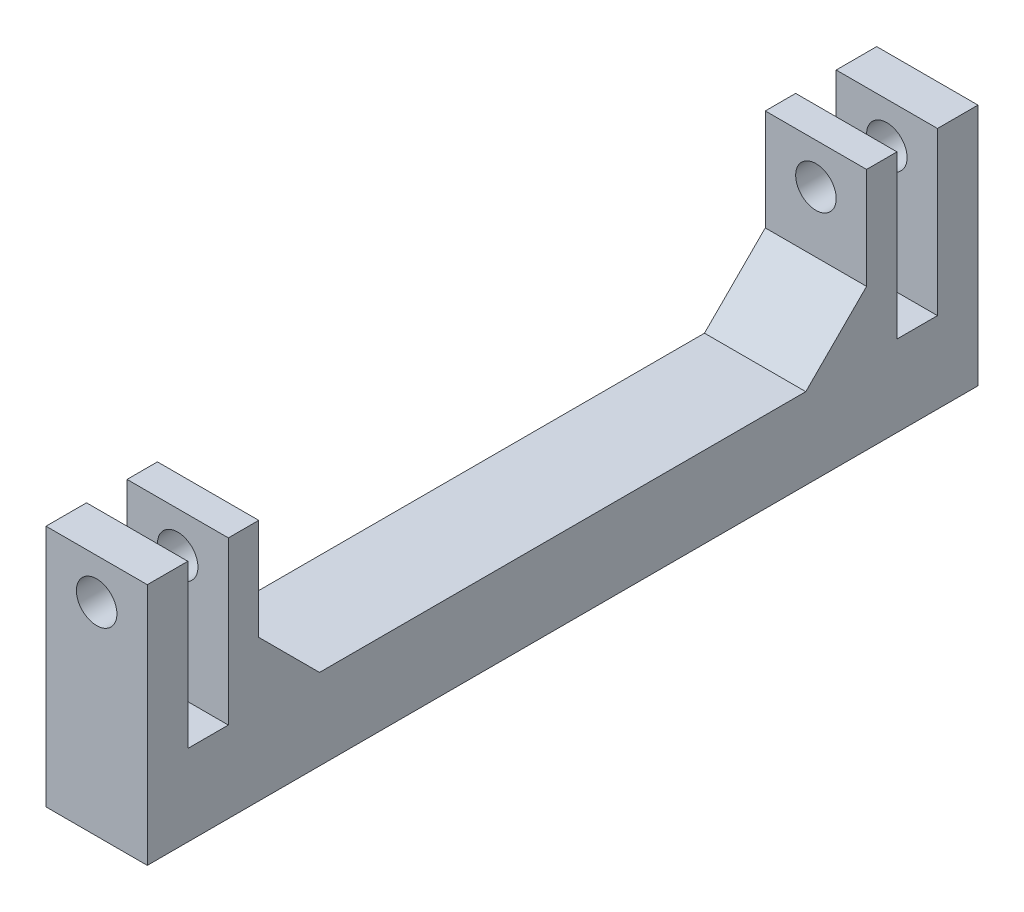
ISO-10303-21;
HEADER;
FILE_DESCRIPTION(('STEP AP214'),'2;1');
FILE_NAME('part.step','',(''),(''),'','','');
FILE_SCHEMA(('AUTOMOTIVE_DESIGN { 1 0 10303 214 1 1 1 1 }'));
ENDSEC;
DATA;
#1=APPLICATION_CONTEXT('core data for automotive mechanical design processes');
#2=APPLICATION_PROTOCOL_DEFINITION('international standard','automotive_design',2000,#1);
#3=PRODUCT_CONTEXT('',#1,'mechanical');
#4=PRODUCT('Part','Part','',(#3));
#5=PRODUCT_RELATED_PRODUCT_CATEGORY('part','',(#4));
#6=PRODUCT_DEFINITION_FORMATION('','',#4);
#7=PRODUCT_DEFINITION_CONTEXT('part definition',#1,'design');
#8=PRODUCT_DEFINITION('design','',#6,#7);
#9=PRODUCT_DEFINITION_SHAPE('','',#8);
#10=(LENGTH_UNIT() NAMED_UNIT(*) SI_UNIT(.MILLI.,.METRE.));
#11=(NAMED_UNIT(*) PLANE_ANGLE_UNIT() SI_UNIT($,.RADIAN.));
#12=(NAMED_UNIT(*) SI_UNIT($,.STERADIAN.) SOLID_ANGLE_UNIT());
#13=UNCERTAINTY_MEASURE_WITH_UNIT(LENGTH_MEASURE(1.E-05),#10,'distance_accuracy_value','');
#14=(GEOMETRIC_REPRESENTATION_CONTEXT(3) GLOBAL_UNCERTAINTY_ASSIGNED_CONTEXT((#13)) GLOBAL_UNIT_ASSIGNED_CONTEXT((#10,
#11,#12)) REPRESENTATION_CONTEXT('',''));
#15=CARTESIAN_POINT('',(0.,0.,0.));
#16=DIRECTION('',(0.,0.,1.));
#17=DIRECTION('',(1.,0.,0.));
#18=AXIS2_PLACEMENT_3D('',#15,#16,#17);
#19=CARTESIAN_POINT('',(-250.,130.,280.));
#20=DIRECTION('',(1.,0.,0.));
#21=DIRECTION('',(0.,1.,0.));
#22=AXIS2_PLACEMENT_3D('',#19,#20,#21);
#23=PLANE('',#22);
#24=DIRECTION('',(0.,-1.,0.));
#25=VECTOR('',#24,1.);
#26=CARTESIAN_POINT('',(-250.,0.,230.));
#27=LINE('',#26,#25);
#28=CARTESIAN_POINT('',(-250.,130.,230.));
#29=VERTEX_POINT('',#28);
#30=CARTESIAN_POINT('',(-250.,10.,230.));
#31=VERTEX_POINT('',#30);
#32=EDGE_CURVE('E214',#29,#31,#27,.T.);
#33=ORIENTED_EDGE('',*,*,#32,.F.);
#34=DIRECTION('',(0.,0.,-1.));
#35=VECTOR('',#34,1.);
#36=CARTESIAN_POINT('',(-250.,130.,230.));
#37=LINE('',#36,#35);
#38=CARTESIAN_POINT('',(-250.,130.,210.));
#39=VERTEX_POINT('',#38);
#40=EDGE_CURVE('E359',#29,#39,#37,.T.);
#41=ORIENTED_EDGE('',*,*,#40,.T.);
#42=DIRECTION('',(0.,-1.,0.));
#43=VECTOR('',#42,1.);
#44=CARTESIAN_POINT('',(-250.,50.,210.));
#45=LINE('',#44,#43);
#46=CARTESIAN_POINT('',(-250.,50.,210.));
#47=VERTEX_POINT('',#46);
#48=EDGE_CURVE('E339',#39,#47,#45,.T.);
#49=ORIENTED_EDGE('',*,*,#48,.T.);
#50=DIRECTION('',(0.,0.,-1.));
#51=VECTOR('',#50,1.);
#52=CARTESIAN_POINT('',(-250.,50.,0.));
#53=LINE('',#52,#51);
#54=CARTESIAN_POINT('',(-250.,50.,190.));
#55=VERTEX_POINT('',#54);
#56=EDGE_CURVE('E356',#47,#55,#53,.T.);
#57=ORIENTED_EDGE('',*,*,#56,.T.);
#58=DIRECTION('',(0.,1.,0.));
#59=VECTOR('',#58,1.);
#60=CARTESIAN_POINT('',(-250.,50.,190.));
#61=LINE('',#60,#59);
#62=CARTESIAN_POINT('',(-250.,130.,190.));
#63=VERTEX_POINT('',#62);
#64=EDGE_CURVE('E349',#55,#63,#61,.T.);
#65=ORIENTED_EDGE('',*,*,#64,.T.);
#66=DIRECTION('',(0.,0.,-1.));
#67=VECTOR('',#66,1.);
#68=CARTESIAN_POINT('',(-250.,130.,230.));
#69=LINE('',#68,#67);
#70=CARTESIAN_POINT('',(-250.,130.,175.));
#71=VERTEX_POINT('',#70);
#72=EDGE_CURVE('E290',#63,#71,#69,.T.);
#73=ORIENTED_EDGE('',*,*,#72,.T.);
#74=DIRECTION('',(0.,-1.,0.));
#75=VECTOR('',#74,1.);
#76=CARTESIAN_POINT('',(-250.,50.,175.));
#77=LINE('',#76,#75);
#78=CARTESIAN_POINT('',(-250.,80.,175.));
#79=VERTEX_POINT('',#78);
#80=EDGE_CURVE('E323',#71,#79,#77,.T.);
#81=ORIENTED_EDGE('',*,*,#80,.T.);
#82=DIRECTION('',(0.,0.707106781186544,0.707106781186551));
#83=VECTOR('',#82,1.);
#84=CARTESIAN_POINT('',(-250.,50.,145.));
#85=LINE('',#84,#83);
#86=CARTESIAN_POINT('',(-250.,50.,145.));
#87=VERTEX_POINT('',#86);
#88=EDGE_CURVE('E334',#87,#79,#85,.T.);
#89=ORIENTED_EDGE('',*,*,#88,.F.);
#90=DIRECTION('',(0.,0.,-1.));
#91=VECTOR('',#90,1.);
#92=CARTESIAN_POINT('',(-250.,50.,50.));
#93=LINE('',#92,#91);
#94=CARTESIAN_POINT('',(-250.,50.,-95.));
#95=VERTEX_POINT('',#94);
#96=EDGE_CURVE('E269',#87,#95,#93,.T.);
#97=ORIENTED_EDGE('',*,*,#96,.T.);
#98=DIRECTION('',(0.,-0.707106781186544,0.707106781186551));
#99=VECTOR('',#98,1.);
#100=CARTESIAN_POINT('',(-250.,50.,-95.));
#101=LINE('',#100,#99);
#102=CARTESIAN_POINT('',(-250.,80.,-125.));
#103=VERTEX_POINT('',#102);
#104=EDGE_CURVE('E11',#103,#95,#101,.T.);
#105=ORIENTED_EDGE('',*,*,#104,.F.);
#106=DIRECTION('',(0.,1.,0.));
#107=VECTOR('',#106,1.);
#108=CARTESIAN_POINT('',(-250.,50.,-125.));
#109=LINE('',#108,#107);
#110=CARTESIAN_POINT('',(-250.,130.,-125.));
#111=VERTEX_POINT('',#110);
#112=EDGE_CURVE('E20',#103,#111,#109,.T.);
#113=ORIENTED_EDGE('',*,*,#112,.T.);
#114=DIRECTION('',(0.,0.,-1.));
#115=VECTOR('',#114,1.);
#116=CARTESIAN_POINT('',(-250.,130.,280.));
#117=LINE('',#116,#115);
#118=CARTESIAN_POINT('',(-250.,130.,-140.));
#119=VERTEX_POINT('',#118);
#120=EDGE_CURVE('E242',#111,#119,#117,.T.);
#121=ORIENTED_EDGE('',*,*,#120,.T.);
#122=DIRECTION('',(0.,-1.,0.));
#123=VECTOR('',#122,1.);
#124=CARTESIAN_POINT('',(-250.,50.,-140.));
#125=LINE('',#124,#123);
#126=CARTESIAN_POINT('',(-250.,50.,-140.));
#127=VERTEX_POINT('',#126);
#128=EDGE_CURVE('E233',#119,#127,#125,.T.);
#129=ORIENTED_EDGE('',*,*,#128,.T.);
#130=DIRECTION('',(0.,0.,-1.));
#131=VECTOR('',#130,1.);
#132=CARTESIAN_POINT('',(-250.,50.,50.));
#133=LINE('',#132,#131);
#134=CARTESIAN_POINT('',(-250.,50.,-160.));
#135=VERTEX_POINT('',#134);
#136=EDGE_CURVE('E227',#127,#135,#133,.T.);
#137=ORIENTED_EDGE('',*,*,#136,.T.);
#138=DIRECTION('',(0.,1.,0.));
#139=VECTOR('',#138,1.);
#140=CARTESIAN_POINT('',(-250.,50.,-160.));
#141=LINE('',#140,#139);
#142=CARTESIAN_POINT('',(-250.,130.,-160.));
#143=VERTEX_POINT('',#142);
#144=EDGE_CURVE('E228',#135,#143,#141,.T.);
#145=ORIENTED_EDGE('',*,*,#144,.T.);
#146=DIRECTION('',(0.,0.,-1.));
#147=VECTOR('',#146,1.);
#148=CARTESIAN_POINT('',(-250.,130.,280.));
#149=LINE('',#148,#147);
#150=CARTESIAN_POINT('',(-250.,130.,-180.));
#151=VERTEX_POINT('',#150);
#152=EDGE_CURVE('E187',#143,#151,#149,.T.);
#153=ORIENTED_EDGE('',*,*,#152,.T.);
#154=DIRECTION('',(0.,-1.,0.));
#155=VECTOR('',#154,1.);
#156=CARTESIAN_POINT('',(-250.,0.,-180.));
#157=LINE('',#156,#155);
#158=CARTESIAN_POINT('',(-250.,10.,-180.));
#159=VERTEX_POINT('',#158);
#160=EDGE_CURVE('E181',#151,#159,#157,.T.);
#161=ORIENTED_EDGE('',*,*,#160,.T.);
#162=DIRECTION('',(0.,0.,1.));
#163=VECTOR('',#162,1.);
#164=CARTESIAN_POINT('',(-250.,10.,280.));
#165=LINE('',#164,#163);
#166=EDGE_CURVE('E184',#159,#31,#165,.T.);
#167=ORIENTED_EDGE('',*,*,#166,.T.);
#168=EDGE_LOOP('',(#33,#41,#49,#57,#65,#73,#81,#89,#97,#105,#113,#121,#129,#137,#145,#153,#161,#167));
#169=FACE_BOUND('',#168,.T.);
#170=ADVANCED_FACE('F17',(#169),#23,.F.);
#171=CARTESIAN_POINT('',(0.,50.,-95.));
#172=DIRECTION('',(0.,0.707106781186551,0.707106781186544));
#173=DIRECTION('',(1.,0.,0.));
#174=AXIS2_PLACEMENT_3D('',#171,#172,#173);
#175=PLANE('',#174);
#176=ORIENTED_EDGE('',*,*,#104,.T.);
#177=DIRECTION('',(1.,0.,0.));
#178=VECTOR('',#177,1.);
#179=CARTESIAN_POINT('',(0.,50.,-95.));
#180=LINE('',#179,#178);
#181=CARTESIAN_POINT('',(-200.,50.,-95.));
#182=VERTEX_POINT('',#181);
#183=EDGE_CURVE('E266',#95,#182,#180,.T.);
#184=ORIENTED_EDGE('',*,*,#183,.T.);
#185=DIRECTION('',(0.,0.707106781186544,-0.707106781186551));
#186=VECTOR('',#185,1.);
#187=CARTESIAN_POINT('',(-200.,50.,-95.));
#188=LINE('',#187,#186);
#189=CARTESIAN_POINT('',(-200.,80.,-125.));
#190=VERTEX_POINT('',#189);
#191=EDGE_CURVE('E304',#182,#190,#188,.T.);
#192=ORIENTED_EDGE('',*,*,#191,.T.);
#193=DIRECTION('',(-1.,0.,0.));
#194=VECTOR('',#193,1.);
#195=CARTESIAN_POINT('',(-250.,80.,-125.));
#196=LINE('',#195,#194);
#197=EDGE_CURVE('E249',#190,#103,#196,.T.);
#198=ORIENTED_EDGE('',*,*,#197,.T.);
#199=EDGE_LOOP('',(#176,#184,#192,#198));
#200=FACE_BOUND('',#199,.T.);
#201=ADVANCED_FACE('F480',(#200),#175,.T.);
#202=CARTESIAN_POINT('',(-250.,50.,-125.));
#203=DIRECTION('',(0.,0.,-1.));
#204=DIRECTION('',(0.,-1.,0.));
#205=AXIS2_PLACEMENT_3D('',#202,#203,#204);
#206=PLANE('',#205);
#207=CARTESIAN_POINT('',(-225.,110.,-125.));
#208=DIRECTION('',(0.,0.,1.));
#209=DIRECTION('',(-1.,0.,0.));
#210=AXIS2_PLACEMENT_3D('',#207,#208,#209);
#211=CIRCLE('',#210,10.);
#212=CARTESIAN_POINT('',(-235.,110.,-125.));
#213=VERTEX_POINT('',#212);
#214=EDGE_CURVE('E424',#213,#213,#211,.T.);
#215=ORIENTED_EDGE('',*,*,#214,.F.);
#216=EDGE_LOOP('',(#215));
#217=FACE_BOUND('',#216,.T.);
#218=ORIENTED_EDGE('',*,*,#197,.F.);
#219=DIRECTION('',(0.,1.,0.));
#220=VECTOR('',#219,1.);
#221=CARTESIAN_POINT('',(-200.,130.,-125.));
#222=LINE('',#221,#220);
#223=CARTESIAN_POINT('',(-200.,130.,-125.));
#224=VERTEX_POINT('',#223);
#225=EDGE_CURVE('E309',#190,#224,#222,.T.);
#226=ORIENTED_EDGE('',*,*,#225,.T.);
#227=DIRECTION('',(-1.,0.,0.));
#228=VECTOR('',#227,1.);
#229=CARTESIAN_POINT('',(-250.,130.,-125.));
#230=LINE('',#229,#228);
#231=EDGE_CURVE('E239',#224,#111,#230,.T.);
#232=ORIENTED_EDGE('',*,*,#231,.T.);
#233=ORIENTED_EDGE('',*,*,#112,.F.);
#234=EDGE_LOOP('',(#218,#226,#232,#233));
#235=FACE_BOUND('',#234,.T.);
#236=ADVANCED_FACE('F484',(#217,#235),#206,.F.);
#237=CARTESIAN_POINT('',(-250.,130.,280.));
#238=DIRECTION('',(0.,-1.,0.));
#239=DIRECTION('',(0.,0.,-1.));
#240=AXIS2_PLACEMENT_3D('',#237,#238,#239);
#241=PLANE('',#240);
#242=ORIENTED_EDGE('',*,*,#231,.F.);
#243=DIRECTION('',(0.,0.,-1.));
#244=VECTOR('',#243,1.);
#245=CARTESIAN_POINT('',(-200.,130.,280.));
#246=LINE('',#245,#244);
#247=CARTESIAN_POINT('',(-200.,130.,-140.));
#248=VERTEX_POINT('',#247);
#249=EDGE_CURVE('E317',#224,#248,#246,.T.);
#250=ORIENTED_EDGE('',*,*,#249,.T.);
#251=DIRECTION('',(-1.,0.,0.));
#252=VECTOR('',#251,1.);
#253=CARTESIAN_POINT('',(-329.133144971436,130.,-140.));
#254=LINE('',#253,#252);
#255=EDGE_CURVE('E236',#248,#119,#254,.T.);
#256=ORIENTED_EDGE('',*,*,#255,.T.);
#257=ORIENTED_EDGE('',*,*,#120,.F.);
#258=EDGE_LOOP('',(#242,#250,#256,#257));
#259=FACE_BOUND('',#258,.T.);
#260=ADVANCED_FACE('F489',(#259),#241,.F.);
#261=CARTESIAN_POINT('',(-329.133144971436,50.,-140.));
#262=DIRECTION('',(0.,0.,1.));
#263=DIRECTION('',(1.,0.,0.));
#264=AXIS2_PLACEMENT_3D('',#261,#262,#263);
#265=PLANE('',#264);
#266=CARTESIAN_POINT('',(-225.,110.,-140.));
#267=DIRECTION('',(0.,0.,-1.));
#268=DIRECTION('',(-1.,0.,0.));
#269=AXIS2_PLACEMENT_3D('',#266,#267,#268);
#270=CIRCLE('',#269,10.);
#271=CARTESIAN_POINT('',(-235.,110.,-140.));
#272=VERTEX_POINT('',#271);
#273=EDGE_CURVE('E418',#272,#272,#270,.T.);
#274=ORIENTED_EDGE('',*,*,#273,.F.);
#275=EDGE_LOOP('',(#274));
#276=FACE_BOUND('',#275,.T.);
#277=DIRECTION('',(0.,-1.,0.));
#278=VECTOR('',#277,1.);
#279=CARTESIAN_POINT('',(-200.,130.,-140.));
#280=LINE('',#279,#278);
#281=CARTESIAN_POINT('',(-200.,50.,-140.));
#282=VERTEX_POINT('',#281);
#283=EDGE_CURVE('E313',#248,#282,#280,.T.);
#284=ORIENTED_EDGE('',*,*,#283,.T.);
#285=DIRECTION('',(-1.,0.,0.));
#286=VECTOR('',#285,1.);
#287=CARTESIAN_POINT('',(0.,50.,-140.));
#288=LINE('',#287,#286);
#289=EDGE_CURVE('E229',#282,#127,#288,.T.);
#290=ORIENTED_EDGE('',*,*,#289,.T.);
#291=ORIENTED_EDGE('',*,*,#128,.F.);
#292=ORIENTED_EDGE('',*,*,#255,.F.);
#293=EDGE_LOOP('',(#284,#290,#291,#292));
#294=FACE_BOUND('',#293,.T.);
#295=ADVANCED_FACE('F495',(#276,#294),#265,.F.);
#296=CARTESIAN_POINT('',(0.,50.,50.));
#297=DIRECTION('',(0.,-1.,0.));
#298=DIRECTION('',(0.,0.,-1.));
#299=AXIS2_PLACEMENT_3D('',#296,#297,#298);
#300=PLANE('',#299);
#301=DIRECTION('',(0.,0.,-1.));
#302=VECTOR('',#301,1.);
#303=CARTESIAN_POINT('',(-200.,50.,280.));
#304=LINE('',#303,#302);
#305=CARTESIAN_POINT('',(-200.,50.,-160.));
#306=VERTEX_POINT('',#305);
#307=EDGE_CURVE('E303',#282,#306,#304,.T.);
#308=ORIENTED_EDGE('',*,*,#307,.T.);
#309=DIRECTION('',(-1.,0.,0.));
#310=VECTOR('',#309,1.);
#311=CARTESIAN_POINT('',(-329.133144971436,50.,-160.));
#312=LINE('',#311,#310);
#313=EDGE_CURVE('E223',#306,#135,#312,.T.);
#314=ORIENTED_EDGE('',*,*,#313,.T.);
#315=ORIENTED_EDGE('',*,*,#136,.F.);
#316=ORIENTED_EDGE('',*,*,#289,.F.);
#317=EDGE_LOOP('',(#308,#314,#315,#316));
#318=FACE_BOUND('',#317,.T.);
#319=ADVANCED_FACE('F499',(#318),#300,.F.);
#320=CARTESIAN_POINT('',(-329.133144971436,50.,-160.));
#321=DIRECTION('',(0.,0.,-1.));
#322=DIRECTION('',(-1.,0.,0.));
#323=AXIS2_PLACEMENT_3D('',#320,#321,#322);
#324=PLANE('',#323);
#325=CARTESIAN_POINT('',(-225.,110.,-160.));
#326=DIRECTION('',(0.,0.,1.));
#327=DIRECTION('',(-1.,0.,0.));
#328=AXIS2_PLACEMENT_3D('',#325,#326,#327);
#329=CIRCLE('',#328,10.);
#330=CARTESIAN_POINT('',(-235.,110.,-160.));
#331=VERTEX_POINT('',#330);
#332=EDGE_CURVE('E428',#331,#331,#329,.T.);
#333=ORIENTED_EDGE('',*,*,#332,.F.);
#334=EDGE_LOOP('',(#333));
#335=FACE_BOUND('',#334,.T.);
#336=DIRECTION('',(0.,1.,0.));
#337=VECTOR('',#336,1.);
#338=CARTESIAN_POINT('',(-200.,130.,-160.));
#339=LINE('',#338,#337);
#340=CARTESIAN_POINT('',(-200.,130.,-160.));
#341=VERTEX_POINT('',#340);
#342=EDGE_CURVE('E298',#306,#341,#339,.T.);
#343=ORIENTED_EDGE('',*,*,#342,.T.);
#344=DIRECTION('',(-1.,0.,0.));
#345=VECTOR('',#344,1.);
#346=CARTESIAN_POINT('',(-250.,130.,-160.));
#347=LINE('',#346,#345);
#348=EDGE_CURVE('E191',#341,#143,#347,.T.);
#349=ORIENTED_EDGE('',*,*,#348,.T.);
#350=ORIENTED_EDGE('',*,*,#144,.F.);
#351=ORIENTED_EDGE('',*,*,#313,.F.);
#352=EDGE_LOOP('',(#343,#349,#350,#351));
#353=FACE_BOUND('',#352,.T.);
#354=ADVANCED_FACE('F502',(#335,#353),#324,.F.);
#355=CARTESIAN_POINT('',(-250.,130.,280.));
#356=DIRECTION('',(0.,-1.,0.));
#357=DIRECTION('',(0.,0.,-1.));
#358=AXIS2_PLACEMENT_3D('',#355,#356,#357);
#359=PLANE('',#358);
#360=ORIENTED_EDGE('',*,*,#348,.F.);
#361=DIRECTION('',(0.,0.,-1.));
#362=VECTOR('',#361,1.);
#363=CARTESIAN_POINT('',(-200.,130.,280.));
#364=LINE('',#363,#362);
#365=CARTESIAN_POINT('',(-200.,130.,-180.));
#366=VERTEX_POINT('',#365);
#367=EDGE_CURVE('E295',#341,#366,#364,.T.);
#368=ORIENTED_EDGE('',*,*,#367,.T.);
#369=DIRECTION('',(-1.,0.,0.));
#370=VECTOR('',#369,1.);
#371=CARTESIAN_POINT('',(0.,130.,-180.));
#372=LINE('',#371,#370);
#373=EDGE_CURVE('E192',#366,#151,#372,.T.);
#374=ORIENTED_EDGE('',*,*,#373,.T.);
#375=ORIENTED_EDGE('',*,*,#152,.F.);
#376=EDGE_LOOP('',(#360,#368,#374,#375));
#377=FACE_BOUND('',#376,.T.);
#378=ADVANCED_FACE('F507',(#377),#359,.F.);
#379=CARTESIAN_POINT('',(0.,0.,-180.));
#380=DIRECTION('',(0.,0.,1.));
#381=DIRECTION('',(1.,0.,0.));
#382=AXIS2_PLACEMENT_3D('',#379,#380,#381);
#383=PLANE('',#382);
#384=CARTESIAN_POINT('',(-225.,110.,-180.));
#385=DIRECTION('',(0.,0.,-1.));
#386=DIRECTION('',(-1.,0.,0.));
#387=AXIS2_PLACEMENT_3D('',#384,#385,#386);
#388=CIRCLE('',#387,10.);
#389=CARTESIAN_POINT('',(-235.,110.,-180.));
#390=VERTEX_POINT('',#389);
#391=EDGE_CURVE('E432',#390,#390,#388,.T.);
#392=ORIENTED_EDGE('',*,*,#391,.F.);
#393=EDGE_LOOP('',(#392));
#394=FACE_BOUND('',#393,.T.);
#395=ORIENTED_EDGE('',*,*,#373,.F.);
#396=DIRECTION('',(0.,-1.,0.));
#397=VECTOR('',#396,1.);
#398=CARTESIAN_POINT('',(-200.,130.,-180.));
#399=LINE('',#398,#397);
#400=CARTESIAN_POINT('',(-200.,10.,-180.));
#401=VERTEX_POINT('',#400);
#402=EDGE_CURVE('E198',#366,#401,#399,.T.);
#403=ORIENTED_EDGE('',*,*,#402,.T.);
#404=DIRECTION('',(-1.,0.,0.));
#405=VECTOR('',#404,1.);
#406=CARTESIAN_POINT('',(-250.,10.,-180.));
#407=LINE('',#406,#405);
#408=EDGE_CURVE('E195',#401,#159,#407,.T.);
#409=ORIENTED_EDGE('',*,*,#408,.T.);
#410=ORIENTED_EDGE('',*,*,#160,.F.);
#411=EDGE_LOOP('',(#395,#403,#409,#410));
#412=FACE_BOUND('',#411,.T.);
#413=ADVANCED_FACE('F196',(#394,#412),#383,.F.);
#414=CARTESIAN_POINT('',(-250.,10.,280.));
#415=DIRECTION('',(0.,1.,0.));
#416=DIRECTION('',(1.,0.,0.));
#417=AXIS2_PLACEMENT_3D('',#414,#415,#416);
#418=PLANE('',#417);
#419=DIRECTION('',(1.,0.,0.));
#420=VECTOR('',#419,1.);
#421=CARTESIAN_POINT('',(0.,10.,230.));
#422=LINE('',#421,#420);
#423=CARTESIAN_POINT('',(-200.,10.,230.));
#424=VERTEX_POINT('',#423);
#425=EDGE_CURVE('E205',#31,#424,#422,.T.);
#426=ORIENTED_EDGE('',*,*,#425,.F.);
#427=ORIENTED_EDGE('',*,*,#166,.F.);
#428=ORIENTED_EDGE('',*,*,#408,.F.);
#429=DIRECTION('',(0.,0.,1.));
#430=VECTOR('',#429,1.);
#431=CARTESIAN_POINT('',(-200.,10.,280.));
#432=LINE('',#431,#430);
#433=EDGE_CURVE('E287',#401,#424,#432,.T.);
#434=ORIENTED_EDGE('',*,*,#433,.T.);
#435=EDGE_LOOP('',(#426,#427,#428,#434));
#436=FACE_BOUND('',#435,.T.);
#437=ADVANCED_FACE('F204',(#436),#418,.F.);
#438=CARTESIAN_POINT('',(0.,0.,230.));
#439=DIRECTION('',(0.,0.,1.));
#440=DIRECTION('',(1.,0.,0.));
#441=AXIS2_PLACEMENT_3D('',#438,#439,#440);
#442=PLANE('',#441);
#443=CARTESIAN_POINT('',(-225.,110.,230.));
#444=DIRECTION('',(0.,0.,-1.));
#445=DIRECTION('',(-1.,0.,0.));
#446=AXIS2_PLACEMENT_3D('',#443,#444,#445);
#447=CIRCLE('',#446,10.);
#448=CARTESIAN_POINT('',(-235.,110.,230.));
#449=VERTEX_POINT('',#448);
#450=EDGE_CURVE('E442',#449,#449,#447,.T.);
#451=ORIENTED_EDGE('',*,*,#450,.T.);
#452=EDGE_LOOP('',(#451));
#453=FACE_BOUND('',#452,.T.);
#454=DIRECTION('',(0.,1.,0.));
#455=VECTOR('',#454,1.);
#456=CARTESIAN_POINT('',(-200.,130.,230.));
#457=LINE('',#456,#455);
#458=CARTESIAN_POINT('',(-200.,130.,230.));
#459=VERTEX_POINT('',#458);
#460=EDGE_CURVE('E283',#424,#459,#457,.T.);
#461=ORIENTED_EDGE('',*,*,#460,.T.);
#462=DIRECTION('',(-1.,0.,0.));
#463=VECTOR('',#462,1.);
#464=CARTESIAN_POINT('',(-250.,130.,230.));
#465=LINE('',#464,#463);
#466=EDGE_CURVE('E362',#459,#29,#465,.T.);
#467=ORIENTED_EDGE('',*,*,#466,.T.);
#468=ORIENTED_EDGE('',*,*,#32,.T.);
#469=ORIENTED_EDGE('',*,*,#425,.T.);
#470=EDGE_LOOP('',(#461,#467,#468,#469));
#471=FACE_BOUND('',#470,.T.);
#472=ADVANCED_FACE('F376',(#453,#471),#442,.T.);
#473=CARTESIAN_POINT('',(-250.,130.,230.));
#474=DIRECTION('',(0.,-1.,0.));
#475=DIRECTION('',(0.,0.,-1.));
#476=AXIS2_PLACEMENT_3D('',#473,#474,#475);
#477=PLANE('',#476);
#478=DIRECTION('',(-1.,0.,0.));
#479=VECTOR('',#478,1.);
#480=CARTESIAN_POINT('',(-250.,130.,210.));
#481=LINE('',#480,#479);
#482=CARTESIAN_POINT('',(-200.,130.,210.));
#483=VERTEX_POINT('',#482);
#484=EDGE_CURVE('E342',#483,#39,#481,.T.);
#485=ORIENTED_EDGE('',*,*,#484,.T.);
#486=ORIENTED_EDGE('',*,*,#40,.F.);
#487=ORIENTED_EDGE('',*,*,#466,.F.);
#488=DIRECTION('',(0.,0.,-1.));
#489=VECTOR('',#488,1.);
#490=CARTESIAN_POINT('',(-200.,130.,280.));
#491=LINE('',#490,#489);
#492=EDGE_CURVE('E282',#459,#483,#491,.T.);
#493=ORIENTED_EDGE('',*,*,#492,.T.);
#494=EDGE_LOOP('',(#485,#486,#487,#493));
#495=FACE_BOUND('',#494,.T.);
#496=ADVANCED_FACE('F380',(#495),#477,.F.);
#497=CARTESIAN_POINT('',(-250.,50.,210.));
#498=DIRECTION('',(0.,0.,1.));
#499=DIRECTION('',(1.,0.,0.));
#500=AXIS2_PLACEMENT_3D('',#497,#498,#499);
#501=PLANE('',#500);
#502=CARTESIAN_POINT('',(-225.,110.,210.));
#503=DIRECTION('',(0.,0.,-1.));
#504=DIRECTION('',(-1.,0.,0.));
#505=AXIS2_PLACEMENT_3D('',#502,#503,#504);
#506=CIRCLE('',#505,10.);
#507=CARTESIAN_POINT('',(-235.,110.,210.));
#508=VERTEX_POINT('',#507);
#509=EDGE_CURVE('E433',#508,#508,#506,.T.);
#510=ORIENTED_EDGE('',*,*,#509,.F.);
#511=EDGE_LOOP('',(#510));
#512=FACE_BOUND('',#511,.T.);
#513=ORIENTED_EDGE('',*,*,#48,.F.);
#514=ORIENTED_EDGE('',*,*,#484,.F.);
#515=DIRECTION('',(0.,-1.,0.));
#516=VECTOR('',#515,1.);
#517=CARTESIAN_POINT('',(-200.,130.,210.));
#518=LINE('',#517,#516);
#519=CARTESIAN_POINT('',(-200.,50.,210.));
#520=VERTEX_POINT('',#519);
#521=EDGE_CURVE('E278',#483,#520,#518,.T.);
#522=ORIENTED_EDGE('',*,*,#521,.T.);
#523=DIRECTION('',(-1.,0.,0.));
#524=VECTOR('',#523,1.);
#525=CARTESIAN_POINT('',(0.,50.,210.));
#526=LINE('',#525,#524);
#527=EDGE_CURVE('E343',#520,#47,#526,.T.);
#528=ORIENTED_EDGE('',*,*,#527,.T.);
#529=EDGE_LOOP('',(#513,#514,#522,#528));
#530=FACE_BOUND('',#529,.T.);
#531=ADVANCED_FACE('F384',(#512,#530),#501,.F.);
#532=CARTESIAN_POINT('',(0.,50.,0.));
#533=DIRECTION('',(0.,-1.,0.));
#534=DIRECTION('',(0.,0.,-1.));
#535=AXIS2_PLACEMENT_3D('',#532,#533,#534);
#536=PLANE('',#535);
#537=ORIENTED_EDGE('',*,*,#56,.F.);
#538=ORIENTED_EDGE('',*,*,#527,.F.);
#539=DIRECTION('',(0.,0.,-1.));
#540=VECTOR('',#539,1.);
#541=CARTESIAN_POINT('',(-200.,50.,280.));
#542=LINE('',#541,#540);
#543=CARTESIAN_POINT('',(-200.,50.,190.));
#544=VERTEX_POINT('',#543);
#545=EDGE_CURVE('E274',#520,#544,#542,.T.);
#546=ORIENTED_EDGE('',*,*,#545,.T.);
#547=DIRECTION('',(-1.,0.,0.));
#548=VECTOR('',#547,1.);
#549=CARTESIAN_POINT('',(-250.,50.,190.));
#550=LINE('',#549,#548);
#551=EDGE_CURVE('E352',#544,#55,#550,.T.);
#552=ORIENTED_EDGE('',*,*,#551,.T.);
#553=EDGE_LOOP('',(#537,#538,#546,#552));
#554=FACE_BOUND('',#553,.T.);
#555=ADVANCED_FACE('F388',(#554),#536,.F.);
#556=CARTESIAN_POINT('',(-250.,50.,190.));
#557=DIRECTION('',(0.,0.,-1.));
#558=DIRECTION('',(0.,-1.,0.));
#559=AXIS2_PLACEMENT_3D('',#556,#557,#558);
#560=PLANE('',#559);
#561=CARTESIAN_POINT('',(-225.,110.,190.));
#562=DIRECTION('',(0.,0.,1.));
#563=DIRECTION('',(-1.,0.,0.));
#564=AXIS2_PLACEMENT_3D('',#561,#562,#563);
#565=CIRCLE('',#564,10.);
#566=CARTESIAN_POINT('',(-235.,110.,190.));
#567=VERTEX_POINT('',#566);
#568=EDGE_CURVE('E453',#567,#567,#565,.T.);
#569=ORIENTED_EDGE('',*,*,#568,.F.);
#570=EDGE_LOOP('',(#569));
#571=FACE_BOUND('',#570,.T.);
#572=ORIENTED_EDGE('',*,*,#64,.F.);
#573=ORIENTED_EDGE('',*,*,#551,.F.);
#574=DIRECTION('',(0.,1.,0.));
#575=VECTOR('',#574,1.);
#576=CARTESIAN_POINT('',(-200.,130.,190.));
#577=LINE('',#576,#575);
#578=CARTESIAN_POINT('',(-200.,130.,190.));
#579=VERTEX_POINT('',#578);
#580=EDGE_CURVE('E265',#544,#579,#577,.T.);
#581=ORIENTED_EDGE('',*,*,#580,.T.);
#582=DIRECTION('',(-1.,0.,0.));
#583=VECTOR('',#582,1.);
#584=CARTESIAN_POINT('',(-250.,130.,190.));
#585=LINE('',#584,#583);
#586=EDGE_CURVE('E293',#579,#63,#585,.T.);
#587=ORIENTED_EDGE('',*,*,#586,.T.);
#588=EDGE_LOOP('',(#572,#573,#581,#587));
#589=FACE_BOUND('',#588,.T.);
#590=ADVANCED_FACE('F393',(#571,#589),#560,.F.);
#591=CARTESIAN_POINT('',(-250.,130.,230.));
#592=DIRECTION('',(0.,-1.,0.));
#593=DIRECTION('',(0.,0.,-1.));
#594=AXIS2_PLACEMENT_3D('',#591,#592,#593);
#595=PLANE('',#594);
#596=DIRECTION('',(-1.,0.,0.));
#597=VECTOR('',#596,1.);
#598=CARTESIAN_POINT('',(-250.,130.,175.));
#599=LINE('',#598,#597);
#600=CARTESIAN_POINT('',(-200.,130.,175.));
#601=VERTEX_POINT('',#600);
#602=EDGE_CURVE('E294',#601,#71,#599,.T.);
#603=ORIENTED_EDGE('',*,*,#602,.T.);
#604=ORIENTED_EDGE('',*,*,#72,.F.);
#605=ORIENTED_EDGE('',*,*,#586,.F.);
#606=DIRECTION('',(0.,0.,-1.));
#607=VECTOR('',#606,1.);
#608=CARTESIAN_POINT('',(-200.,130.,280.));
#609=LINE('',#608,#607);
#610=EDGE_CURVE('E262',#579,#601,#609,.T.);
#611=ORIENTED_EDGE('',*,*,#610,.T.);
#612=EDGE_LOOP('',(#603,#604,#605,#611));
#613=FACE_BOUND('',#612,.T.);
#614=ADVANCED_FACE('F399',(#613),#595,.F.);
#615=CARTESIAN_POINT('',(-250.,50.,175.));
#616=DIRECTION('',(0.,0.,1.));
#617=DIRECTION('',(1.,0.,0.));
#618=AXIS2_PLACEMENT_3D('',#615,#616,#617);
#619=PLANE('',#618);
#620=CARTESIAN_POINT('',(-225.,110.,175.));
#621=DIRECTION('',(0.,0.,-1.));
#622=DIRECTION('',(-1.,0.,0.));
#623=AXIS2_PLACEMENT_3D('',#620,#621,#622);
#624=CIRCLE('',#623,10.);
#625=CARTESIAN_POINT('',(-235.,110.,175.));
#626=VERTEX_POINT('',#625);
#627=EDGE_CURVE('E448',#626,#626,#624,.T.);
#628=ORIENTED_EDGE('',*,*,#627,.F.);
#629=EDGE_LOOP('',(#628));
#630=FACE_BOUND('',#629,.T.);
#631=DIRECTION('',(1.,0.,0.));
#632=VECTOR('',#631,1.);
#633=CARTESIAN_POINT('',(0.,80.,175.));
#634=LINE('',#633,#632);
#635=CARTESIAN_POINT('',(-200.,80.,175.));
#636=VERTEX_POINT('',#635);
#637=EDGE_CURVE('E326',#79,#636,#634,.T.);
#638=ORIENTED_EDGE('',*,*,#637,.F.);
#639=ORIENTED_EDGE('',*,*,#80,.F.);
#640=ORIENTED_EDGE('',*,*,#602,.F.);
#641=DIRECTION('',(0.,-1.,0.));
#642=VECTOR('',#641,1.);
#643=CARTESIAN_POINT('',(-200.,130.,175.));
#644=LINE('',#643,#642);
#645=EDGE_CURVE('E260',#601,#636,#644,.T.);
#646=ORIENTED_EDGE('',*,*,#645,.T.);
#647=EDGE_LOOP('',(#638,#639,#640,#646));
#648=FACE_BOUND('',#647,.T.);
#649=ADVANCED_FACE('F405',(#630,#648),#619,.F.);
#650=CARTESIAN_POINT('',(0.,50.,145.));
#651=DIRECTION('',(0.,0.707106781186551,-0.707106781186544));
#652=DIRECTION('',(-1.,0.,0.));
#653=AXIS2_PLACEMENT_3D('',#650,#651,#652);
#654=PLANE('',#653);
#655=DIRECTION('',(0.,-0.707106781186544,-0.707106781186551));
#656=VECTOR('',#655,1.);
#657=CARTESIAN_POINT('',(-200.,80.,175.));
#658=LINE('',#657,#656);
#659=CARTESIAN_POINT('',(-200.,50.,145.));
#660=VERTEX_POINT('',#659);
#661=EDGE_CURVE('E415',#636,#660,#658,.T.);
#662=ORIENTED_EDGE('',*,*,#661,.T.);
#663=DIRECTION('',(-1.,0.,0.));
#664=VECTOR('',#663,1.);
#665=CARTESIAN_POINT('',(0.,50.,145.));
#666=LINE('',#665,#664);
#667=EDGE_CURVE('E270',#660,#87,#666,.T.);
#668=ORIENTED_EDGE('',*,*,#667,.T.);
#669=ORIENTED_EDGE('',*,*,#88,.T.);
#670=ORIENTED_EDGE('',*,*,#637,.T.);
#671=EDGE_LOOP('',(#662,#668,#669,#670));
#672=FACE_BOUND('',#671,.T.);
#673=ADVANCED_FACE('F413',(#672),#654,.T.);
#674=CARTESIAN_POINT('',(0.,50.,50.));
#675=DIRECTION('',(0.,-1.,0.));
#676=DIRECTION('',(0.,0.,-1.));
#677=AXIS2_PLACEMENT_3D('',#674,#675,#676);
#678=PLANE('',#677);
#679=ORIENTED_EDGE('',*,*,#667,.F.);
#680=DIRECTION('',(0.,0.,-1.));
#681=VECTOR('',#680,1.);
#682=CARTESIAN_POINT('',(-200.,50.,280.));
#683=LINE('',#682,#681);
#684=EDGE_CURVE('E308',#660,#182,#683,.T.);
#685=ORIENTED_EDGE('',*,*,#684,.T.);
#686=ORIENTED_EDGE('',*,*,#183,.F.);
#687=ORIENTED_EDGE('',*,*,#96,.F.);
#688=EDGE_LOOP('',(#679,#685,#686,#687));
#689=FACE_BOUND('',#688,.T.);
#690=ADVANCED_FACE('F410',(#689),#678,.F.);
#691=CARTESIAN_POINT('',(-200.,130.,280.));
#692=DIRECTION('',(-1.,0.,0.));
#693=DIRECTION('',(0.,0.,1.));
#694=AXIS2_PLACEMENT_3D('',#691,#692,#693);
#695=PLANE('',#694);
#696=ORIENTED_EDGE('',*,*,#661,.F.);
#697=ORIENTED_EDGE('',*,*,#645,.F.);
#698=ORIENTED_EDGE('',*,*,#610,.F.);
#699=ORIENTED_EDGE('',*,*,#580,.F.);
#700=ORIENTED_EDGE('',*,*,#545,.F.);
#701=ORIENTED_EDGE('',*,*,#521,.F.);
#702=ORIENTED_EDGE('',*,*,#492,.F.);
#703=ORIENTED_EDGE('',*,*,#460,.F.);
#704=ORIENTED_EDGE('',*,*,#433,.F.);
#705=ORIENTED_EDGE('',*,*,#402,.F.);
#706=ORIENTED_EDGE('',*,*,#367,.F.);
#707=ORIENTED_EDGE('',*,*,#342,.F.);
#708=ORIENTED_EDGE('',*,*,#307,.F.);
#709=ORIENTED_EDGE('',*,*,#283,.F.);
#710=ORIENTED_EDGE('',*,*,#249,.F.);
#711=ORIENTED_EDGE('',*,*,#225,.F.);
#712=ORIENTED_EDGE('',*,*,#191,.F.);
#713=ORIENTED_EDGE('',*,*,#684,.F.);
#714=EDGE_LOOP('',(#696,#697,#698,#699,#700,#701,#702,#703,#704,#705,#706,#707,#708,#709,#710,
#711,#712,#713));
#715=FACE_BOUND('',#714,.T.);
#716=ADVANCED_FACE('F524',(#715),#695,.F.);
#717=CARTESIAN_POINT('',(-225.,110.,280.));
#718=DIRECTION('',(0.,0.,-1.));
#719=DIRECTION('',(-1.,0.,0.));
#720=AXIS2_PLACEMENT_3D('',#717,#718,#719);
#721=CYLINDRICAL_SURFACE('',#720,10.);
#722=ORIENTED_EDGE('',*,*,#273,.T.);
#723=EDGE_LOOP('',(#722));
#724=FACE_BOUND('',#723,.T.);
#725=ORIENTED_EDGE('',*,*,#214,.T.);
#726=EDGE_LOOP('',(#725));
#727=FACE_BOUND('',#726,.T.);
#728=ADVANCED_FACE('F528',(#724,#727),#721,.F.);
#729=CARTESIAN_POINT('',(-225.,110.,280.));
#730=DIRECTION('',(0.,0.,-1.));
#731=DIRECTION('',(-1.,0.,0.));
#732=AXIS2_PLACEMENT_3D('',#729,#730,#731);
#733=CYLINDRICAL_SURFACE('',#732,10.);
#734=ORIENTED_EDGE('',*,*,#391,.T.);
#735=EDGE_LOOP('',(#734));
#736=FACE_BOUND('',#735,.T.);
#737=ORIENTED_EDGE('',*,*,#332,.T.);
#738=EDGE_LOOP('',(#737));
#739=FACE_BOUND('',#738,.T.);
#740=ADVANCED_FACE('F532',(#736,#739),#733,.F.);
#741=CARTESIAN_POINT('',(-225.,110.,230.));
#742=DIRECTION('',(0.,0.,-1.));
#743=DIRECTION('',(-1.,0.,0.));
#744=AXIS2_PLACEMENT_3D('',#741,#742,#743);
#745=CYLINDRICAL_SURFACE('',#744,10.);
#746=ORIENTED_EDGE('',*,*,#509,.T.);
#747=EDGE_LOOP('',(#746));
#748=FACE_BOUND('',#747,.T.);
#749=ORIENTED_EDGE('',*,*,#450,.F.);
#750=EDGE_LOOP('',(#749));
#751=FACE_BOUND('',#750,.T.);
#752=ADVANCED_FACE('F536',(#748,#751),#745,.F.);
#753=CARTESIAN_POINT('',(-225.,110.,230.));
#754=DIRECTION('',(0.,0.,-1.));
#755=DIRECTION('',(-1.,0.,0.));
#756=AXIS2_PLACEMENT_3D('',#753,#754,#755);
#757=CYLINDRICAL_SURFACE('',#756,10.);
#758=ORIENTED_EDGE('',*,*,#627,.T.);
#759=EDGE_LOOP('',(#758));
#760=FACE_BOUND('',#759,.T.);
#761=ORIENTED_EDGE('',*,*,#568,.T.);
#762=EDGE_LOOP('',(#761));
#763=FACE_BOUND('',#762,.T.);
#764=ADVANCED_FACE('F466',(#760,#763),#757,.F.);
#765=CLOSED_SHELL('',(#170,#201,#236,#260,#295,#319,#354,#378,#413,#437,#472,#496,#531,#555,
#590,#614,#649,#673,#690,#716,#728,#740,#752,#764));
#766=MANIFOLD_SOLID_BREP('B1',#765);
#767=ADVANCED_BREP_SHAPE_REPRESENTATION('',(#18,#766),#14);
#768=SHAPE_DEFINITION_REPRESENTATION(#9,#767);
ENDSEC;
END-ISO-10303-21;
